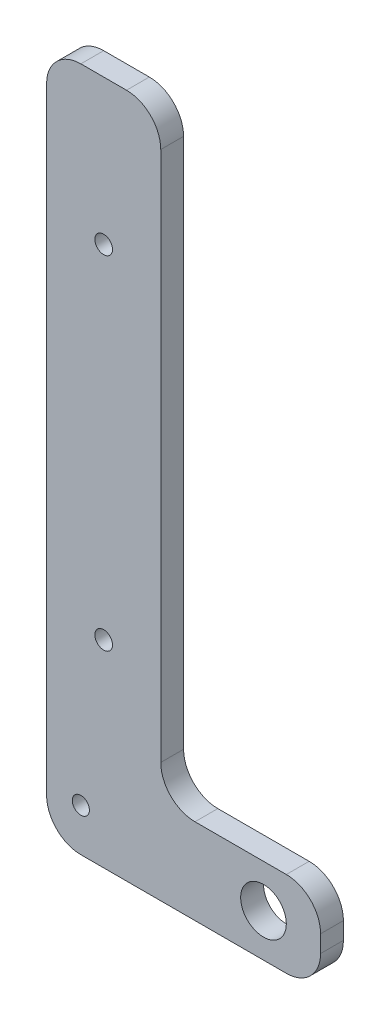
ISO-10303-21;
HEADER;
FILE_DESCRIPTION(('STEP AP214'),'2;1');
FILE_NAME('part.step','',(''),(''),'','','');
FILE_SCHEMA(('AUTOMOTIVE_DESIGN { 1 0 10303 214 1 1 1 1 }'));
ENDSEC;
DATA;
#1=APPLICATION_CONTEXT('core data for automotive mechanical design processes');
#2=APPLICATION_PROTOCOL_DEFINITION('international standard','automotive_design',2000,#1);
#3=PRODUCT_CONTEXT('',#1,'mechanical');
#4=PRODUCT('Part','Part','',(#3));
#5=PRODUCT_RELATED_PRODUCT_CATEGORY('part','',(#4));
#6=PRODUCT_DEFINITION_FORMATION('','',#4);
#7=PRODUCT_DEFINITION_CONTEXT('part definition',#1,'design');
#8=PRODUCT_DEFINITION('design','',#6,#7);
#9=PRODUCT_DEFINITION_SHAPE('','',#8);
#10=(LENGTH_UNIT() NAMED_UNIT(*) SI_UNIT(.MILLI.,.METRE.));
#11=(NAMED_UNIT(*) PLANE_ANGLE_UNIT() SI_UNIT($,.RADIAN.));
#12=(NAMED_UNIT(*) SI_UNIT($,.STERADIAN.) SOLID_ANGLE_UNIT());
#13=UNCERTAINTY_MEASURE_WITH_UNIT(LENGTH_MEASURE(1.E-05),#10,'distance_accuracy_value','');
#14=(GEOMETRIC_REPRESENTATION_CONTEXT(3) GLOBAL_UNCERTAINTY_ASSIGNED_CONTEXT((#13)) GLOBAL_UNIT_ASSIGNED_CONTEXT((#10,
#11,#12)) REPRESENTATION_CONTEXT('',''));
#15=CARTESIAN_POINT('',(0.,0.,0.));
#16=DIRECTION('',(0.,0.,1.));
#17=DIRECTION('',(1.,0.,0.));
#18=AXIS2_PLACEMENT_3D('',#15,#16,#17);
#19=CARTESIAN_POINT('',(-24.,0.,2.));
#20=DIRECTION('',(-1.,0.,0.));
#21=DIRECTION('',(0.,0.,1.));
#22=AXIS2_PLACEMENT_3D('',#19,#20,#21);
#23=PLANE('',#22);
#24=DIRECTION('',(0.,1.,0.));
#25=VECTOR('',#24,1.);
#26=CARTESIAN_POINT('',(-24.,0.,2.));
#27=LINE('',#26,#25);
#28=CARTESIAN_POINT('',(-24.,-1.5,2.));
#29=VERTEX_POINT('',#28);
#30=CARTESIAN_POINT('',(-24.,106.5,2.));
#31=VERTEX_POINT('',#30);
#32=EDGE_CURVE('E255',#29,#31,#27,.T.);
#33=ORIENTED_EDGE('',*,*,#32,.T.);
#34=DIRECTION('',(0.,0.,-1.));
#35=VECTOR('',#34,1.);
#36=CARTESIAN_POINT('',(-24.,106.5,2.));
#37=LINE('',#36,#35);
#38=CARTESIAN_POINT('',(-24.,106.5,-2.));
#39=VERTEX_POINT('',#38);
#40=EDGE_CURVE('E192',#31,#39,#37,.T.);
#41=ORIENTED_EDGE('',*,*,#40,.T.);
#42=DIRECTION('',(0.,1.,0.));
#43=VECTOR('',#42,1.);
#44=CARTESIAN_POINT('',(-24.,0.,-2.));
#45=LINE('',#44,#43);
#46=CARTESIAN_POINT('',(-24.,-1.5,-2.));
#47=VERTEX_POINT('',#46);
#48=EDGE_CURVE('E234',#47,#39,#45,.T.);
#49=ORIENTED_EDGE('',*,*,#48,.F.);
#50=DIRECTION('',(0.,0.,-1.));
#51=VECTOR('',#50,1.);
#52=CARTESIAN_POINT('',(-24.,-1.5,2.));
#53=LINE('',#52,#51);
#54=EDGE_CURVE('E190',#47,#29,#53,.F.);
#55=ORIENTED_EDGE('',*,*,#54,.T.);
#56=EDGE_LOOP('',(#33,#41,#49,#55));
#57=FACE_BOUND('',#56,.T.);
#58=ADVANCED_FACE('F35',(#57),#23,.T.);
#59=CARTESIAN_POINT('',(0.,-7.5,2.));
#60=DIRECTION('',(0.,1.,0.));
#61=DIRECTION('',(0.,0.,1.));
#62=AXIS2_PLACEMENT_3D('',#59,#60,#61);
#63=PLANE('',#62);
#64=DIRECTION('',(1.,0.,0.));
#65=VECTOR('',#64,1.);
#66=CARTESIAN_POINT('',(0.,-7.5,-2.));
#67=LINE('',#66,#65);
#68=CARTESIAN_POINT('',(-18.,-7.5,-2.));
#69=VERTEX_POINT('',#68);
#70=CARTESIAN_POINT('',(18.,-7.5,-2.));
#71=VERTEX_POINT('',#70);
#72=EDGE_CURVE('E146',#69,#71,#67,.T.);
#73=ORIENTED_EDGE('',*,*,#72,.T.);
#74=DIRECTION('',(0.,0.,-1.));
#75=VECTOR('',#74,1.);
#76=CARTESIAN_POINT('',(18.,-7.5,2.));
#77=LINE('',#76,#75);
#78=CARTESIAN_POINT('',(18.,-7.5,2.));
#79=VERTEX_POINT('',#78);
#80=EDGE_CURVE('E171',#71,#79,#77,.F.);
#81=ORIENTED_EDGE('',*,*,#80,.T.);
#82=DIRECTION('',(1.,0.,0.));
#83=VECTOR('',#82,1.);
#84=CARTESIAN_POINT('',(0.,-7.5,2.));
#85=LINE('',#84,#83);
#86=CARTESIAN_POINT('',(-18.,-7.5,2.));
#87=VERTEX_POINT('',#86);
#88=EDGE_CURVE('E260',#87,#79,#85,.T.);
#89=ORIENTED_EDGE('',*,*,#88,.F.);
#90=DIRECTION('',(0.,0.,-1.));
#91=VECTOR('',#90,1.);
#92=CARTESIAN_POINT('',(-18.,-7.5,-2.));
#93=LINE('',#92,#91);
#94=EDGE_CURVE('E168',#87,#69,#93,.T.);
#95=ORIENTED_EDGE('',*,*,#94,.T.);
#96=EDGE_LOOP('',(#73,#81,#89,#95));
#97=FACE_BOUND('',#96,.T.);
#98=ADVANCED_FACE('F267',(#97),#63,.F.);
#99=CARTESIAN_POINT('',(24.,0.,2.));
#100=DIRECTION('',(1.,0.,0.));
#101=DIRECTION('',(0.,0.,-1.));
#102=AXIS2_PLACEMENT_3D('',#99,#100,#101);
#103=PLANE('',#102);
#104=DIRECTION('',(0.,-1.,0.));
#105=VECTOR('',#104,1.);
#106=CARTESIAN_POINT('',(24.,0.,2.));
#107=LINE('',#106,#105);
#108=CARTESIAN_POINT('',(24.,1.5,2.));
#109=VERTEX_POINT('',#108);
#110=CARTESIAN_POINT('',(24.,-1.5,2.));
#111=VERTEX_POINT('',#110);
#112=EDGE_CURVE('E222',#109,#111,#107,.T.);
#113=ORIENTED_EDGE('',*,*,#112,.T.);
#114=DIRECTION('',(0.,0.,-1.));
#115=VECTOR('',#114,1.);
#116=CARTESIAN_POINT('',(24.,-1.5,-2.));
#117=LINE('',#116,#115);
#118=CARTESIAN_POINT('',(24.,-1.5,-2.));
#119=VERTEX_POINT('',#118);
#120=EDGE_CURVE('E137',#111,#119,#117,.T.);
#121=ORIENTED_EDGE('',*,*,#120,.T.);
#122=DIRECTION('',(0.,-1.,0.));
#123=VECTOR('',#122,1.);
#124=CARTESIAN_POINT('',(24.,0.,-2.));
#125=LINE('',#124,#123);
#126=CARTESIAN_POINT('',(24.,1.5,-2.));
#127=VERTEX_POINT('',#126);
#128=EDGE_CURVE('E129',#127,#119,#125,.T.);
#129=ORIENTED_EDGE('',*,*,#128,.F.);
#130=DIRECTION('',(0.,0.,-1.));
#131=VECTOR('',#130,1.);
#132=CARTESIAN_POINT('',(24.,1.5,2.));
#133=LINE('',#132,#131);
#134=EDGE_CURVE('E143',#127,#109,#133,.F.);
#135=ORIENTED_EDGE('',*,*,#134,.T.);
#136=EDGE_LOOP('',(#113,#121,#129,#135));
#137=FACE_BOUND('',#136,.T.);
#138=ADVANCED_FACE('F142',(#137),#103,.T.);
#139=CARTESIAN_POINT('',(0.,7.5,2.));
#140=DIRECTION('',(0.,1.,0.));
#141=DIRECTION('',(0.,0.,1.));
#142=AXIS2_PLACEMENT_3D('',#139,#140,#141);
#143=PLANE('',#142);
#144=DIRECTION('',(1.,0.,0.));
#145=VECTOR('',#144,1.);
#146=CARTESIAN_POINT('',(0.,7.5,2.));
#147=LINE('',#146,#145);
#148=CARTESIAN_POINT('',(2.,7.5,2.));
#149=VERTEX_POINT('',#148);
#150=CARTESIAN_POINT('',(18.,7.5,2.));
#151=VERTEX_POINT('',#150);
#152=EDGE_CURVE('E215',#149,#151,#147,.T.);
#153=ORIENTED_EDGE('',*,*,#152,.T.);
#154=DIRECTION('',(0.,0.,-1.));
#155=VECTOR('',#154,1.);
#156=CARTESIAN_POINT('',(18.,7.5,2.));
#157=LINE('',#156,#155);
#158=CARTESIAN_POINT('',(18.,7.5,-2.));
#159=VERTEX_POINT('',#158);
#160=EDGE_CURVE('E197',#151,#159,#157,.T.);
#161=ORIENTED_EDGE('',*,*,#160,.T.);
#162=DIRECTION('',(1.,0.,0.));
#163=VECTOR('',#162,1.);
#164=CARTESIAN_POINT('',(0.,7.5,-2.));
#165=LINE('',#164,#163);
#166=CARTESIAN_POINT('',(2.,7.5,-2.));
#167=VERTEX_POINT('',#166);
#168=EDGE_CURVE('E131',#167,#159,#165,.T.);
#169=ORIENTED_EDGE('',*,*,#168,.F.);
#170=DIRECTION('',(0.,0.,-1.));
#171=VECTOR('',#170,1.);
#172=CARTESIAN_POINT('',(2.,7.5,2.));
#173=LINE('',#172,#171);
#174=EDGE_CURVE('E195',#167,#149,#173,.F.);
#175=ORIENTED_EDGE('',*,*,#174,.T.);
#176=EDGE_LOOP('',(#153,#161,#169,#175));
#177=FACE_BOUND('',#176,.T.);
#178=ADVANCED_FACE('F206',(#177),#143,.T.);
#179=CARTESIAN_POINT('',(-4.,0.,2.));
#180=DIRECTION('',(-1.,0.,0.));
#181=DIRECTION('',(0.,0.,1.));
#182=AXIS2_PLACEMENT_3D('',#179,#180,#181);
#183=PLANE('',#182);
#184=DIRECTION('',(0.,1.,0.));
#185=VECTOR('',#184,1.);
#186=CARTESIAN_POINT('',(-4.,0.,-2.));
#187=LINE('',#186,#185);
#188=CARTESIAN_POINT('',(-4.,13.5,-2.));
#189=VERTEX_POINT('',#188);
#190=CARTESIAN_POINT('',(-4.,106.5,-2.));
#191=VERTEX_POINT('',#190);
#192=EDGE_CURVE('E200',#189,#191,#187,.T.);
#193=ORIENTED_EDGE('',*,*,#192,.T.);
#194=DIRECTION('',(0.,0.,-1.));
#195=VECTOR('',#194,1.);
#196=CARTESIAN_POINT('',(-4.,106.5,2.));
#197=LINE('',#196,#195);
#198=CARTESIAN_POINT('',(-4.,106.5,2.));
#199=VERTEX_POINT('',#198);
#200=EDGE_CURVE('E188',#191,#199,#197,.F.);
#201=ORIENTED_EDGE('',*,*,#200,.T.);
#202=DIRECTION('',(0.,1.,0.));
#203=VECTOR('',#202,1.);
#204=CARTESIAN_POINT('',(-4.,0.,2.));
#205=LINE('',#204,#203);
#206=CARTESIAN_POINT('',(-4.,13.5,2.));
#207=VERTEX_POINT('',#206);
#208=EDGE_CURVE('E214',#207,#199,#205,.T.);
#209=ORIENTED_EDGE('',*,*,#208,.F.);
#210=DIRECTION('',(0.,0.,-1.));
#211=VECTOR('',#210,1.);
#212=CARTESIAN_POINT('',(-4.,13.5,2.));
#213=LINE('',#212,#211);
#214=EDGE_CURVE('E185',#207,#189,#213,.T.);
#215=ORIENTED_EDGE('',*,*,#214,.T.);
#216=EDGE_LOOP('',(#193,#201,#209,#215));
#217=FACE_BOUND('',#216,.T.);
#218=ADVANCED_FACE('F217',(#217),#183,.F.);
#219=CARTESIAN_POINT('',(-18.,0.,2.));
#220=DIRECTION('',(0.,0.,-1.));
#221=DIRECTION('',(-1.,0.,0.));
#222=AXIS2_PLACEMENT_3D('',#219,#220,#221);
#223=CYLINDRICAL_SURFACE('',#222,1.5);
#224=CARTESIAN_POINT('',(-18.,0.,2.));
#225=DIRECTION('',(0.,0.,1.));
#226=DIRECTION('',(1.,0.,0.));
#227=AXIS2_PLACEMENT_3D('',#224,#225,#226);
#228=CIRCLE('',#227,1.5);
#229=CARTESIAN_POINT('',(-16.5,0.,2.));
#230=VERTEX_POINT('',#229);
#231=EDGE_CURVE('E155',#230,#230,#228,.T.);
#232=ORIENTED_EDGE('',*,*,#231,.T.);
#233=EDGE_LOOP('',(#232));
#234=FACE_BOUND('',#233,.T.);
#235=CARTESIAN_POINT('',(-18.,0.,-2.));
#236=DIRECTION('',(0.,0.,1.));
#237=DIRECTION('',(1.,0.,0.));
#238=AXIS2_PLACEMENT_3D('',#235,#236,#237);
#239=CIRCLE('',#238,1.5);
#240=CARTESIAN_POINT('',(-16.5,0.,-2.));
#241=VERTEX_POINT('',#240);
#242=EDGE_CURVE('E242',#241,#241,#239,.T.);
#243=ORIENTED_EDGE('',*,*,#242,.F.);
#244=EDGE_LOOP('',(#243));
#245=FACE_BOUND('',#244,.T.);
#246=ADVANCED_FACE('F327',(#234,#245),#223,.F.);
#247=CARTESIAN_POINT('',(0.,112.5,2.));
#248=DIRECTION('',(0.,1.,0.));
#249=DIRECTION('',(0.,0.,1.));
#250=AXIS2_PLACEMENT_3D('',#247,#248,#249);
#251=PLANE('',#250);
#252=DIRECTION('',(1.,0.,0.));
#253=VECTOR('',#252,1.);
#254=CARTESIAN_POINT('',(0.,112.5,2.));
#255=LINE('',#254,#253);
#256=CARTESIAN_POINT('',(-18.,112.5,2.));
#257=VERTEX_POINT('',#256);
#258=CARTESIAN_POINT('',(-10.,112.5,2.));
#259=VERTEX_POINT('',#258);
#260=EDGE_CURVE('E219',#257,#259,#255,.T.);
#261=ORIENTED_EDGE('',*,*,#260,.T.);
#262=DIRECTION('',(0.,0.,-1.));
#263=VECTOR('',#262,1.);
#264=CARTESIAN_POINT('',(-10.,112.5,-2.));
#265=LINE('',#264,#263);
#266=CARTESIAN_POINT('',(-10.,112.5,-2.));
#267=VERTEX_POINT('',#266);
#268=EDGE_CURVE('E182',#259,#267,#265,.T.);
#269=ORIENTED_EDGE('',*,*,#268,.T.);
#270=DIRECTION('',(1.,0.,0.));
#271=VECTOR('',#270,1.);
#272=CARTESIAN_POINT('',(0.,112.5,-2.));
#273=LINE('',#272,#271);
#274=CARTESIAN_POINT('',(-18.,112.5,-2.));
#275=VERTEX_POINT('',#274);
#276=EDGE_CURVE('E240',#275,#267,#273,.T.);
#277=ORIENTED_EDGE('',*,*,#276,.F.);
#278=DIRECTION('',(0.,0.,-1.));
#279=VECTOR('',#278,1.);
#280=CARTESIAN_POINT('',(-18.,112.5,2.));
#281=LINE('',#280,#279);
#282=EDGE_CURVE('E57',#275,#257,#281,.F.);
#283=ORIENTED_EDGE('',*,*,#282,.T.);
#284=EDGE_LOOP('',(#261,#269,#277,#283));
#285=FACE_BOUND('',#284,.T.);
#286=ADVANCED_FACE('F281',(#285),#251,.T.);
#287=CARTESIAN_POINT('',(-14.,87.1,2.));
#288=DIRECTION('',(0.,0.,-1.));
#289=DIRECTION('',(-1.,0.,0.));
#290=AXIS2_PLACEMENT_3D('',#287,#288,#289);
#291=CYLINDRICAL_SURFACE('',#290,1.55);
#292=CARTESIAN_POINT('',(-14.,87.1,2.));
#293=DIRECTION('',(0.,0.,1.));
#294=DIRECTION('',(1.,0.,0.));
#295=AXIS2_PLACEMENT_3D('',#292,#293,#294);
#296=CIRCLE('',#295,1.55);
#297=CARTESIAN_POINT('',(-12.45,87.1,2.));
#298=VERTEX_POINT('',#297);
#299=EDGE_CURVE('E250',#298,#298,#296,.T.);
#300=ORIENTED_EDGE('',*,*,#299,.T.);
#301=EDGE_LOOP('',(#300));
#302=FACE_BOUND('',#301,.T.);
#303=CARTESIAN_POINT('',(-14.,87.1,-2.));
#304=DIRECTION('',(0.,0.,1.));
#305=DIRECTION('',(1.,0.,0.));
#306=AXIS2_PLACEMENT_3D('',#303,#304,#305);
#307=CIRCLE('',#306,1.55);
#308=CARTESIAN_POINT('',(-12.45,87.1,-2.));
#309=VERTEX_POINT('',#308);
#310=EDGE_CURVE('E231',#309,#309,#307,.T.);
#311=ORIENTED_EDGE('',*,*,#310,.F.);
#312=EDGE_LOOP('',(#311));
#313=FACE_BOUND('',#312,.T.);
#314=ADVANCED_FACE('F301',(#302,#313),#291,.F.);
#315=CARTESIAN_POINT('',(-14.,27.1,2.));
#316=DIRECTION('',(0.,0.,-1.));
#317=DIRECTION('',(-1.,0.,0.));
#318=AXIS2_PLACEMENT_3D('',#315,#316,#317);
#319=CYLINDRICAL_SURFACE('',#318,1.55);
#320=CARTESIAN_POINT('',(-14.,27.1,2.));
#321=DIRECTION('',(0.,0.,1.));
#322=DIRECTION('',(1.,0.,0.));
#323=AXIS2_PLACEMENT_3D('',#320,#321,#322);
#324=CIRCLE('',#323,1.55);
#325=CARTESIAN_POINT('',(-12.45,27.1,2.));
#326=VERTEX_POINT('',#325);
#327=EDGE_CURVE('E246',#326,#326,#324,.T.);
#328=ORIENTED_EDGE('',*,*,#327,.T.);
#329=EDGE_LOOP('',(#328));
#330=FACE_BOUND('',#329,.T.);
#331=CARTESIAN_POINT('',(-14.,27.1,-2.));
#332=DIRECTION('',(0.,0.,1.));
#333=DIRECTION('',(1.,0.,0.));
#334=AXIS2_PLACEMENT_3D('',#331,#332,#333);
#335=CIRCLE('',#334,1.55);
#336=CARTESIAN_POINT('',(-12.45,27.1,-2.));
#337=VERTEX_POINT('',#336);
#338=EDGE_CURVE('E228',#337,#337,#335,.T.);
#339=ORIENTED_EDGE('',*,*,#338,.F.);
#340=EDGE_LOOP('',(#339));
#341=FACE_BOUND('',#340,.T.);
#342=ADVANCED_FACE('F304',(#330,#341),#319,.F.);
#343=CARTESIAN_POINT('',(14.,0.,2.));
#344=DIRECTION('',(0.,0.,-1.));
#345=DIRECTION('',(-1.,0.,0.));
#346=AXIS2_PLACEMENT_3D('',#343,#344,#345);
#347=CYLINDRICAL_SURFACE('',#346,4.);
#348=CARTESIAN_POINT('',(14.,0.,2.));
#349=DIRECTION('',(0.,0.,1.));
#350=DIRECTION('',(1.,0.,0.));
#351=AXIS2_PLACEMENT_3D('',#348,#349,#350);
#352=CIRCLE('',#351,4.);
#353=CARTESIAN_POINT('',(18.,0.,2.));
#354=VERTEX_POINT('',#353);
#355=EDGE_CURVE('E151',#354,#354,#352,.T.);
#356=ORIENTED_EDGE('',*,*,#355,.T.);
#357=EDGE_LOOP('',(#356));
#358=FACE_BOUND('',#357,.T.);
#359=CARTESIAN_POINT('',(14.,0.,-2.));
#360=DIRECTION('',(0.,0.,1.));
#361=DIRECTION('',(1.,0.,0.));
#362=AXIS2_PLACEMENT_3D('',#359,#360,#361);
#363=CIRCLE('',#362,4.);
#364=CARTESIAN_POINT('',(18.,0.,-2.));
#365=VERTEX_POINT('',#364);
#366=EDGE_CURVE('E158',#365,#365,#363,.T.);
#367=ORIENTED_EDGE('',*,*,#366,.F.);
#368=EDGE_LOOP('',(#367));
#369=FACE_BOUND('',#368,.T.);
#370=ADVANCED_FACE('F307',(#358,#369),#347,.F.);
#371=CARTESIAN_POINT('',(0.,0.,2.));
#372=DIRECTION('',(0.,0.,1.));
#373=DIRECTION('',(1.,0.,0.));
#374=AXIS2_PLACEMENT_3D('',#371,#372,#373);
#375=PLANE('',#374);
#376=ORIENTED_EDGE('',*,*,#327,.F.);
#377=EDGE_LOOP('',(#376));
#378=FACE_BOUND('',#377,.T.);
#379=ORIENTED_EDGE('',*,*,#299,.F.);
#380=EDGE_LOOP('',(#379));
#381=FACE_BOUND('',#380,.T.);
#382=ORIENTED_EDGE('',*,*,#88,.T.);
#383=CARTESIAN_POINT('',(18.,-1.5,2.));
#384=DIRECTION('',(0.,0.,1.));
#385=DIRECTION('',(1.,0.,0.));
#386=AXIS2_PLACEMENT_3D('',#383,#384,#385);
#387=CIRCLE('',#386,6.);
#388=EDGE_CURVE('E179',#79,#111,#387,.T.);
#389=ORIENTED_EDGE('',*,*,#388,.T.);
#390=ORIENTED_EDGE('',*,*,#112,.F.);
#391=CARTESIAN_POINT('',(18.,1.5,2.));
#392=DIRECTION('',(0.,0.,1.));
#393=DIRECTION('',(1.,0.,0.));
#394=AXIS2_PLACEMENT_3D('',#391,#392,#393);
#395=CIRCLE('',#394,6.);
#396=EDGE_CURVE('E150',#109,#151,#395,.T.);
#397=ORIENTED_EDGE('',*,*,#396,.T.);
#398=ORIENTED_EDGE('',*,*,#152,.F.);
#399=CARTESIAN_POINT('',(2.,13.5,2.));
#400=DIRECTION('',(0.,0.,1.));
#401=DIRECTION('',(1.,0.,0.));
#402=AXIS2_PLACEMENT_3D('',#399,#400,#401);
#403=CIRCLE('',#402,6.);
#404=EDGE_CURVE('E11',#149,#207,#403,.F.);
#405=ORIENTED_EDGE('',*,*,#404,.T.);
#406=ORIENTED_EDGE('',*,*,#208,.T.);
#407=CARTESIAN_POINT('',(-10.,106.5,2.));
#408=DIRECTION('',(0.,0.,1.));
#409=DIRECTION('',(1.,0.,0.));
#410=AXIS2_PLACEMENT_3D('',#407,#408,#409);
#411=CIRCLE('',#410,6.);
#412=EDGE_CURVE('E50',#199,#259,#411,.T.);
#413=ORIENTED_EDGE('',*,*,#412,.T.);
#414=ORIENTED_EDGE('',*,*,#260,.F.);
#415=CARTESIAN_POINT('',(-18.,106.5,2.));
#416=DIRECTION('',(0.,0.,1.));
#417=DIRECTION('',(1.,0.,0.));
#418=AXIS2_PLACEMENT_3D('',#415,#416,#417);
#419=CIRCLE('',#418,6.);
#420=EDGE_CURVE('E176',#257,#31,#419,.T.);
#421=ORIENTED_EDGE('',*,*,#420,.T.);
#422=ORIENTED_EDGE('',*,*,#32,.F.);
#423=CARTESIAN_POINT('',(-18.,-1.5,2.));
#424=DIRECTION('',(0.,0.,1.));
#425=DIRECTION('',(1.,0.,0.));
#426=AXIS2_PLACEMENT_3D('',#423,#424,#425);
#427=CIRCLE('',#426,6.);
#428=EDGE_CURVE('E174',#29,#87,#427,.T.);
#429=ORIENTED_EDGE('',*,*,#428,.T.);
#430=EDGE_LOOP('',(#382,#389,#390,#397,#398,#405,#406,#413,#414,#421,#422,#429));
#431=FACE_BOUND('',#430,.T.);
#432=ORIENTED_EDGE('',*,*,#231,.F.);
#433=EDGE_LOOP('',(#432));
#434=FACE_BOUND('',#433,.T.);
#435=ORIENTED_EDGE('',*,*,#355,.F.);
#436=EDGE_LOOP('',(#435));
#437=FACE_BOUND('',#436,.T.);
#438=ADVANCED_FACE('F212',(#378,#381,#431,#434,#437),#375,.T.);
#439=CARTESIAN_POINT('',(0.,0.,-2.));
#440=DIRECTION('',(0.,0.,1.));
#441=DIRECTION('',(1.,0.,0.));
#442=AXIS2_PLACEMENT_3D('',#439,#440,#441);
#443=PLANE('',#442);
#444=ORIENTED_EDGE('',*,*,#338,.T.);
#445=EDGE_LOOP('',(#444));
#446=FACE_BOUND('',#445,.T.);
#447=ORIENTED_EDGE('',*,*,#310,.T.);
#448=EDGE_LOOP('',(#447));
#449=FACE_BOUND('',#448,.T.);
#450=ORIENTED_EDGE('',*,*,#128,.T.);
#451=CARTESIAN_POINT('',(18.,-1.5,-2.));
#452=DIRECTION('',(0.,0.,1.));
#453=DIRECTION('',(1.,0.,0.));
#454=AXIS2_PLACEMENT_3D('',#451,#452,#453);
#455=CIRCLE('',#454,6.);
#456=EDGE_CURVE('E166',#119,#71,#455,.F.);
#457=ORIENTED_EDGE('',*,*,#456,.T.);
#458=ORIENTED_EDGE('',*,*,#72,.F.);
#459=CARTESIAN_POINT('',(-18.,-1.5,-2.));
#460=DIRECTION('',(0.,0.,1.));
#461=DIRECTION('',(1.,0.,0.));
#462=AXIS2_PLACEMENT_3D('',#459,#460,#461);
#463=CIRCLE('',#462,6.);
#464=EDGE_CURVE('E136',#69,#47,#463,.F.);
#465=ORIENTED_EDGE('',*,*,#464,.T.);
#466=ORIENTED_EDGE('',*,*,#48,.T.);
#467=CARTESIAN_POINT('',(-18.,106.5,-2.));
#468=DIRECTION('',(0.,0.,1.));
#469=DIRECTION('',(1.,0.,0.));
#470=AXIS2_PLACEMENT_3D('',#467,#468,#469);
#471=CIRCLE('',#470,6.);
#472=EDGE_CURVE('E162',#39,#275,#471,.F.);
#473=ORIENTED_EDGE('',*,*,#472,.T.);
#474=ORIENTED_EDGE('',*,*,#276,.T.);
#475=CARTESIAN_POINT('',(-10.,106.5,-2.));
#476=DIRECTION('',(0.,0.,1.));
#477=DIRECTION('',(1.,0.,0.));
#478=AXIS2_PLACEMENT_3D('',#475,#476,#477);
#479=CIRCLE('',#478,6.);
#480=EDGE_CURVE('E164',#267,#191,#479,.F.);
#481=ORIENTED_EDGE('',*,*,#480,.T.);
#482=ORIENTED_EDGE('',*,*,#192,.F.);
#483=CARTESIAN_POINT('',(2.,13.5,-2.));
#484=DIRECTION('',(0.,0.,1.));
#485=DIRECTION('',(1.,0.,0.));
#486=AXIS2_PLACEMENT_3D('',#483,#484,#485);
#487=CIRCLE('',#486,6.);
#488=EDGE_CURVE('E43',#189,#167,#487,.T.);
#489=ORIENTED_EDGE('',*,*,#488,.T.);
#490=ORIENTED_EDGE('',*,*,#168,.T.);
#491=CARTESIAN_POINT('',(18.,1.5,-2.));
#492=DIRECTION('',(0.,0.,1.));
#493=DIRECTION('',(1.,0.,0.));
#494=AXIS2_PLACEMENT_3D('',#491,#492,#493);
#495=CIRCLE('',#494,6.);
#496=EDGE_CURVE('E125',#159,#127,#495,.F.);
#497=ORIENTED_EDGE('',*,*,#496,.T.);
#498=EDGE_LOOP('',(#450,#457,#458,#465,#466,#473,#474,#481,#482,#489,#490,#497));
#499=FACE_BOUND('',#498,.T.);
#500=ORIENTED_EDGE('',*,*,#242,.T.);
#501=EDGE_LOOP('',(#500));
#502=FACE_BOUND('',#501,.T.);
#503=ORIENTED_EDGE('',*,*,#366,.T.);
#504=EDGE_LOOP('',(#503));
#505=FACE_BOUND('',#504,.T.);
#506=ADVANCED_FACE('F127',(#446,#449,#499,#502,#505),#443,.F.);
#507=CARTESIAN_POINT('',(18.,-1.5,2.));
#508=DIRECTION('',(0.,0.,1.));
#509=DIRECTION('',(1.,0.,0.));
#510=AXIS2_PLACEMENT_3D('',#507,#508,#509);
#511=CYLINDRICAL_SURFACE('',#510,6.);
#512=ORIENTED_EDGE('',*,*,#388,.F.);
#513=ORIENTED_EDGE('',*,*,#80,.F.);
#514=ORIENTED_EDGE('',*,*,#456,.F.);
#515=ORIENTED_EDGE('',*,*,#120,.F.);
#516=EDGE_LOOP('',(#512,#513,#514,#515));
#517=FACE_BOUND('',#516,.T.);
#518=ADVANCED_FACE('F263',(#517),#511,.T.);
#519=CARTESIAN_POINT('',(-10.,106.5,2.));
#520=DIRECTION('',(0.,0.,1.));
#521=DIRECTION('',(1.,0.,0.));
#522=AXIS2_PLACEMENT_3D('',#519,#520,#521);
#523=CYLINDRICAL_SURFACE('',#522,6.);
#524=ORIENTED_EDGE('',*,*,#412,.F.);
#525=ORIENTED_EDGE('',*,*,#200,.F.);
#526=ORIENTED_EDGE('',*,*,#480,.F.);
#527=ORIENTED_EDGE('',*,*,#268,.F.);
#528=EDGE_LOOP('',(#524,#525,#526,#527));
#529=FACE_BOUND('',#528,.T.);
#530=ADVANCED_FACE('F284',(#529),#523,.T.);
#531=CARTESIAN_POINT('',(-18.,106.5,2.));
#532=DIRECTION('',(0.,0.,-1.));
#533=DIRECTION('',(-1.,0.,0.));
#534=AXIS2_PLACEMENT_3D('',#531,#532,#533);
#535=CYLINDRICAL_SURFACE('',#534,6.);
#536=ORIENTED_EDGE('',*,*,#420,.F.);
#537=ORIENTED_EDGE('',*,*,#282,.F.);
#538=ORIENTED_EDGE('',*,*,#472,.F.);
#539=ORIENTED_EDGE('',*,*,#40,.F.);
#540=EDGE_LOOP('',(#536,#537,#538,#539));
#541=FACE_BOUND('',#540,.T.);
#542=ADVANCED_FACE('F280',(#541),#535,.T.);
#543=CARTESIAN_POINT('',(-18.,-1.5,2.));
#544=DIRECTION('',(0.,0.,1.));
#545=DIRECTION('',(1.,0.,0.));
#546=AXIS2_PLACEMENT_3D('',#543,#544,#545);
#547=CYLINDRICAL_SURFACE('',#546,6.);
#548=ORIENTED_EDGE('',*,*,#428,.F.);
#549=ORIENTED_EDGE('',*,*,#54,.F.);
#550=ORIENTED_EDGE('',*,*,#464,.F.);
#551=ORIENTED_EDGE('',*,*,#94,.F.);
#552=EDGE_LOOP('',(#548,#549,#550,#551));
#553=FACE_BOUND('',#552,.T.);
#554=ADVANCED_FACE('F272',(#553),#547,.T.);
#555=CARTESIAN_POINT('',(18.,1.5,2.));
#556=DIRECTION('',(0.,0.,-1.));
#557=DIRECTION('',(-1.,0.,0.));
#558=AXIS2_PLACEMENT_3D('',#555,#556,#557);
#559=CYLINDRICAL_SURFACE('',#558,6.);
#560=ORIENTED_EDGE('',*,*,#396,.F.);
#561=ORIENTED_EDGE('',*,*,#134,.F.);
#562=ORIENTED_EDGE('',*,*,#496,.F.);
#563=ORIENTED_EDGE('',*,*,#160,.F.);
#564=EDGE_LOOP('',(#560,#561,#562,#563));
#565=FACE_BOUND('',#564,.T.);
#566=ADVANCED_FACE('F149',(#565),#559,.T.);
#567=CARTESIAN_POINT('',(2.,13.5,2.));
#568=DIRECTION('',(0.,0.,-1.));
#569=DIRECTION('',(-1.,0.,0.));
#570=AXIS2_PLACEMENT_3D('',#567,#568,#569);
#571=CYLINDRICAL_SURFACE('',#570,6.);
#572=ORIENTED_EDGE('',*,*,#404,.F.);
#573=ORIENTED_EDGE('',*,*,#174,.F.);
#574=ORIENTED_EDGE('',*,*,#488,.F.);
#575=ORIENTED_EDGE('',*,*,#214,.F.);
#576=EDGE_LOOP('',(#572,#573,#574,#575));
#577=FACE_BOUND('',#576,.T.);
#578=ADVANCED_FACE('F37',(#577),#571,.F.);
#579=CLOSED_SHELL('',(#58,#98,#138,#178,#218,#246,#286,#314,#342,#370,#438,#506,#518,#530,#542,
#554,#566,#578));
#580=MANIFOLD_SOLID_BREP('B2',#579);
#581=ADVANCED_BREP_SHAPE_REPRESENTATION('',(#18,#580),#14);
#582=SHAPE_DEFINITION_REPRESENTATION(#9,#581);
ENDSEC;
END-ISO-10303-21;
